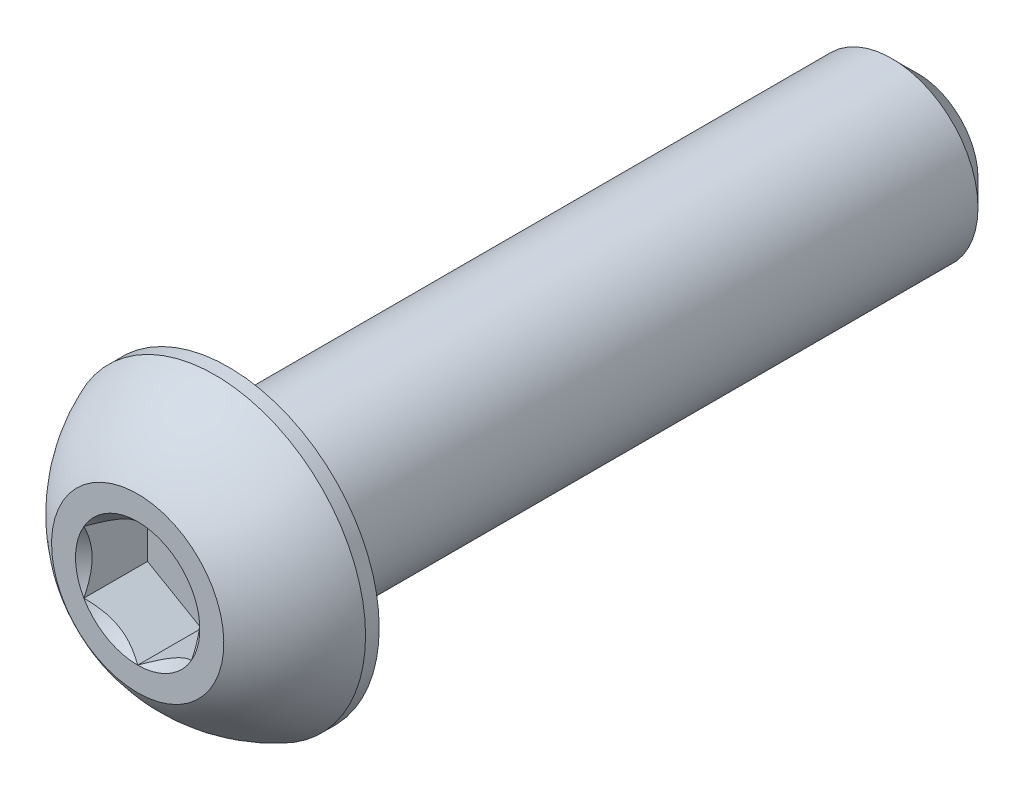
ISO-10303-21;
HEADER;
FILE_DESCRIPTION(('STEP AP214'),'2;1');
FILE_NAME('part.step','',(''),(''),'','','');
FILE_SCHEMA(('AUTOMOTIVE_DESIGN { 1 0 10303 214 1 1 1 1 }'));
ENDSEC;
DATA;
#1=APPLICATION_CONTEXT('core data for automotive mechanical design processes');
#2=APPLICATION_PROTOCOL_DEFINITION('international standard','automotive_design',2000,#1);
#3=PRODUCT_CONTEXT('',#1,'mechanical');
#4=PRODUCT('Part','Part','',(#3));
#5=PRODUCT_RELATED_PRODUCT_CATEGORY('part','',(#4));
#6=PRODUCT_DEFINITION_FORMATION('','',#4);
#7=PRODUCT_DEFINITION_CONTEXT('part definition',#1,'design');
#8=PRODUCT_DEFINITION('design','',#6,#7);
#9=PRODUCT_DEFINITION_SHAPE('','',#8);
#10=(LENGTH_UNIT() NAMED_UNIT(*) SI_UNIT(.MILLI.,.METRE.));
#11=(NAMED_UNIT(*) PLANE_ANGLE_UNIT() SI_UNIT($,.RADIAN.));
#12=(NAMED_UNIT(*) SI_UNIT($,.STERADIAN.) SOLID_ANGLE_UNIT());
#13=UNCERTAINTY_MEASURE_WITH_UNIT(LENGTH_MEASURE(1.E-05),#10,'distance_accuracy_value','');
#14=(GEOMETRIC_REPRESENTATION_CONTEXT(3) GLOBAL_UNCERTAINTY_ASSIGNED_CONTEXT((#13)) GLOBAL_UNIT_ASSIGNED_CONTEXT((#10,
#11,#12)) REPRESENTATION_CONTEXT('',''));
#15=CARTESIAN_POINT('',(0.,0.,0.));
#16=DIRECTION('',(0.,0.,1.));
#17=DIRECTION('',(1.,0.,0.));
#18=AXIS2_PLACEMENT_3D('',#15,#16,#17);
#19=CARTESIAN_POINT('',(0.,-3.175,-28.7528));
#20=DIRECTION('',(0.,0.,-1.));
#21=DIRECTION('',(0.,1.,0.));
#22=AXIS2_PLACEMENT_3D('',#19,#20,#21);
#23=PLANE('',#22);
#24=CARTESIAN_POINT('',(0.,0.,-28.7528));
#25=DIRECTION('',(0.,0.,-1.));
#26=DIRECTION('',(0.,1.,0.));
#27=AXIS2_PLACEMENT_3D('',#24,#25,#26);
#28=CIRCLE('',#27,2.22250000000001);
#29=CARTESIAN_POINT('',(0.,-2.2225,-28.7528));
#30=VERTEX_POINT('',#29);
#31=EDGE_CURVE('E173',#30,#30,#28,.T.);
#32=ORIENTED_EDGE('',*,*,#31,.T.);
#33=EDGE_LOOP('',(#32));
#34=FACE_BOUND('',#33,.T.);
#35=ADVANCED_FACE('F34',(#34),#23,.T.);
#36=CARTESIAN_POINT('',(0.,0.,-28.7528));
#37=DIRECTION('',(0.,0.,-1.));
#38=DIRECTION('',(0.,1.,0.));
#39=AXIS2_PLACEMENT_3D('',#36,#37,#38);
#40=CYLINDRICAL_SURFACE('',#39,3.175);
#41=CARTESIAN_POINT('',(0.,0.,-27.8003));
#42=DIRECTION('',(0.,0.,-1.));
#43=DIRECTION('',(0.,1.,0.));
#44=AXIS2_PLACEMENT_3D('',#41,#42,#43);
#45=CIRCLE('',#44,3.175);
#46=CARTESIAN_POINT('',(0.,-3.175,-27.8003));
#47=VERTEX_POINT('',#46);
#48=EDGE_CURVE('E47',#47,#47,#45,.F.);
#49=ORIENTED_EDGE('',*,*,#48,.T.);
#50=EDGE_LOOP('',(#49));
#51=FACE_BOUND('',#50,.T.);
#52=CARTESIAN_POINT('',(0.,0.,-3.3528));
#53=DIRECTION('',(0.,0.,1.));
#54=DIRECTION('',(1.,0.,0.));
#55=AXIS2_PLACEMENT_3D('',#52,#53,#54);
#56=CIRCLE('',#55,3.175);
#57=CARTESIAN_POINT('',(3.175,0.,-3.3528));
#58=VERTEX_POINT('',#57);
#59=EDGE_CURVE('E170',#58,#58,#56,.F.);
#60=ORIENTED_EDGE('',*,*,#59,.T.);
#61=EDGE_LOOP('',(#60));
#62=FACE_BOUND('',#61,.T.);
#63=ADVANCED_FACE('F178',(#51,#62),#40,.T.);
#64=CARTESIAN_POINT('',(0.,0.,-28.7528));
#65=DIRECTION('',(0.,0.,1.));
#66=DIRECTION('',(0.,-1.,0.));
#67=AXIS2_PLACEMENT_3D('',#64,#65,#66);
#68=CONICAL_SURFACE('',#67,2.22250000000001,0.785398163397446);
#69=CARTESIAN_POINT('',(0.,-3.175,-27.8003));
#70=CARTESIAN_POINT('',(0.,-3.165078125,-27.810221875));
#71=CARTESIAN_POINT('',(0.,-3.15515625,-27.82014375));
#72=CARTESIAN_POINT('',(0.,-3.1353125,-27.8399875));
#73=CARTESIAN_POINT('',(0.,-3.125390625,-27.849909375));
#74=CARTESIAN_POINT('',(0.,-3.105546875,-27.869753125));
#75=CARTESIAN_POINT('',(0.,-3.095625,-27.879675));
#76=CARTESIAN_POINT('',(0.,-3.07578125,-27.89951875));
#77=CARTESIAN_POINT('',(0.,-3.065859375,-27.909440625));
#78=CARTESIAN_POINT('',(0.,-3.046015625,-27.929284375));
#79=CARTESIAN_POINT('',(0.,-3.03609375,-27.93920625));
#80=CARTESIAN_POINT('',(0.,-3.01625,-27.95905));
#81=CARTESIAN_POINT('',(0.,-3.006328125,-27.968971875));
#82=CARTESIAN_POINT('',(0.,-2.986484375,-27.988815625));
#83=CARTESIAN_POINT('',(0.,-2.9765625,-27.9987375));
#84=CARTESIAN_POINT('',(0.,-2.95671875,-28.01858125));
#85=CARTESIAN_POINT('',(0.,-2.946796875,-28.028503125));
#86=CARTESIAN_POINT('',(0.,-2.926953125,-28.048346875));
#87=CARTESIAN_POINT('',(0.,-2.91703125,-28.05826875));
#88=CARTESIAN_POINT('',(0.,-2.8971875,-28.0781125));
#89=CARTESIAN_POINT('',(0.,-2.887265625,-28.088034375));
#90=CARTESIAN_POINT('',(0.,-2.867421875,-28.107878125));
#91=CARTESIAN_POINT('',(0.,-2.8575,-28.1178));
#92=CARTESIAN_POINT('',(0.,-2.83765625,-28.13764375));
#93=CARTESIAN_POINT('',(0.,-2.827734375,-28.147565625));
#94=CARTESIAN_POINT('',(0.,-2.807890625,-28.167409375));
#95=CARTESIAN_POINT('',(0.,-2.79796875,-28.17733125));
#96=CARTESIAN_POINT('',(0.,-2.778125,-28.197175));
#97=CARTESIAN_POINT('',(0.,-2.768203125,-28.207096875));
#98=CARTESIAN_POINT('',(0.,-2.748359375,-28.226940625));
#99=CARTESIAN_POINT('',(0.,-2.7384375,-28.2368625));
#100=CARTESIAN_POINT('',(0.,-2.71859375,-28.25670625));
#101=CARTESIAN_POINT('',(0.,-2.708671875,-28.266628125));
#102=CARTESIAN_POINT('',(0.,-2.688828125,-28.286471875));
#103=CARTESIAN_POINT('',(0.,-2.67890625,-28.29639375));
#104=CARTESIAN_POINT('',(0.,-2.6590625,-28.3162375));
#105=CARTESIAN_POINT('',(0.,-2.649140625,-28.326159375));
#106=CARTESIAN_POINT('',(0.,-2.629296875,-28.346003125));
#107=CARTESIAN_POINT('',(0.,-2.619375,-28.355925));
#108=CARTESIAN_POINT('',(0.,-2.59953125,-28.37576875));
#109=CARTESIAN_POINT('',(0.,-2.589609375,-28.385690625));
#110=CARTESIAN_POINT('',(0.,-2.569765625,-28.405534375));
#111=CARTESIAN_POINT('',(0.,-2.55984375,-28.41545625));
#112=CARTESIAN_POINT('',(0.,-2.54,-28.4353));
#113=CARTESIAN_POINT('',(0.,-2.530078125,-28.445221875));
#114=CARTESIAN_POINT('',(0.,-2.510234375,-28.465065625));
#115=CARTESIAN_POINT('',(0.,-2.5003125,-28.4749875));
#116=CARTESIAN_POINT('',(0.,-2.48046875,-28.49483125));
#117=CARTESIAN_POINT('',(0.,-2.470546875,-28.504753125));
#118=CARTESIAN_POINT('',(0.,-2.450703125,-28.524596875));
#119=CARTESIAN_POINT('',(0.,-2.44078125,-28.53451875));
#120=CARTESIAN_POINT('',(0.,-2.4209375,-28.5543625));
#121=CARTESIAN_POINT('',(0.,-2.411015625,-28.564284375));
#122=CARTESIAN_POINT('',(0.,-2.391171875,-28.584128125));
#123=CARTESIAN_POINT('',(0.,-2.38125,-28.59405));
#124=CARTESIAN_POINT('',(0.,-2.36140625,-28.61389375));
#125=CARTESIAN_POINT('',(0.,-2.351484375,-28.623815625));
#126=CARTESIAN_POINT('',(0.,-2.331640625,-28.643659375));
#127=CARTESIAN_POINT('',(0.,-2.32171875,-28.65358125));
#128=CARTESIAN_POINT('',(0.,-2.301875,-28.673425));
#129=CARTESIAN_POINT('',(0.,-2.291953125,-28.683346875));
#130=CARTESIAN_POINT('',(0.,-2.272109375,-28.703190625));
#131=CARTESIAN_POINT('',(0.,-2.2621875,-28.7131125));
#132=CARTESIAN_POINT('',(0.,-2.24234375,-28.73295625));
#133=CARTESIAN_POINT('',(0.,-2.232421875,-28.742878125));
#134=CARTESIAN_POINT('',(0.,-2.2225,-28.7528));
#135=B_SPLINE_CURVE_WITH_KNOTS('',3,(#69,#70,#71,#72,#73,#74,#75,#76,#77,#78,#79,#80,#81,#82,
#83,#84,#85,#86,#87,#88,#89,#90,#91,#92,#93,#94,#95,#96,#97,#98,#99,#100,#101,#102,#103,#104,
#105,#106,#107,#108,#109,#110,#111,#112,#113,#114,#115,#116,#117,#118,#119,#120,#121,#122,#123,
#124,#125,#126,#127,#128,#129,#130,#131,#132,#133,#134),.UNSPECIFIED.,.F.,.F.,(4,2,2,2,2,2,2,2,
2,2,2,2,2,2,2,2,2,2,2,2,2,2,2,2,2,2,2,2,2,2,2,2,4),(0.,0.042094950567512,0.0841899011350241,
0.126284851702536,0.168379802270048,0.21047475283756,0.25256970340507,0.294664653972582,
0.336759604540094,0.378854555107606,0.420949505675118,0.463044456242628,0.50513940681014,
0.547234357377652,0.589329307945164,0.631424258512676,0.673519209080186,0.715614159647698,
0.75770911021521,0.799804060782723,0.841899011350235,0.883993961917747,0.926088912485257,
0.968183863052769,1.01027881362028,1.05237376418779,1.09446871475531,1.13656366532281,
1.17865861589033,1.22075356645784,1.26284851702535,1.30494346759286,1.34703841816037),.UNSPECIFIED.);
#136=EDGE_CURVE('BSEAM36',#47,#30,#135,.T.);
#137=ORIENTED_EDGE('',*,*,#48,.F.);
#138=ORIENTED_EDGE('',*,*,#31,.F.);
#139=ORIENTED_EDGE('',*,*,#136,.T.);
#140=ORIENTED_EDGE('',*,*,#136,.F.);
#141=EDGE_LOOP('',(#137,#139,#138,#140));
#142=FACE_BOUND('',#141,.T.);
#143=ADVANCED_FACE('F36',(#142),#68,.T.);
#144=CARTESIAN_POINT('',(0.,0.,-5.060315));
#145=DIRECTION('',(0.,0.,1.));
#146=DIRECTION('',(0.,-1.,0.));
#147=AXIS2_PLACEMENT_3D('',#144,#145,#146);
#148=SPHERICAL_SURFACE('',#147,5.97389428256184);
#149=CARTESIAN_POINT('',(0.,0.,0.));
#150=DIRECTION('',(0.,0.,1.));
#151=DIRECTION('',(1.,0.,0.));
#152=AXIS2_PLACEMENT_3D('',#149,#150,#151);
#153=CIRCLE('',#152,3.175);
#154=CARTESIAN_POINT('',(0.,-3.175,0.));
#155=VERTEX_POINT('',#154);
#156=EDGE_CURVE('E167',#155,#155,#153,.T.);
#157=CARTESIAN_POINT('',(0.,0.,-2.84988));
#158=DIRECTION('',(0.,0.,1.));
#159=DIRECTION('',(1.,0.,0.));
#160=AXIS2_PLACEMENT_3D('',#157,#158,#159);
#161=CIRCLE('',#160,5.5499);
#162=CARTESIAN_POINT('',(0.,-5.5499,-2.84988));
#163=VERTEX_POINT('',#162);
#164=EDGE_CURVE('E161',#163,#163,#161,.T.);
#165=CARTESIAN_POINT('',(0.,-3.175,0.));
#166=CARTESIAN_POINT('',(0.,-3.20828343957184,-0.0208830076580502));
#167=CARTESIAN_POINT('',(0.,-3.24136078860705,-0.0420944789280503));
#168=CARTESIAN_POINT('',(0.,-3.30709055775141,-0.0851658910984718));
#169=CARTESIAN_POINT('',(0.,-3.33974297786056,-0.107025831998893));
#170=CARTESIAN_POINT('',(0.,-3.40461014130008,-0.151385725836676));
#171=CARTESIAN_POINT('',(0.,-3.43682488463043,-0.173885678774039));
#172=CARTESIAN_POINT('',(0.,-3.50080416139461,-0.219516822259479));
#173=CARTESIAN_POINT('',(0.,-3.53256869482844,-0.242648012807557));
#174=CARTESIAN_POINT('',(0.,-3.59563518208834,-0.289532629449102));
#175=CARTESIAN_POINT('',(0.,-3.62693713591442,-0.313286055542569));
#176=CARTESIAN_POINT('',(0.,-3.68906627753106,-0.36140589409133));
#177=CARTESIAN_POINT('',(0.,-3.71989346532163,-0.385772306546626));
#178=CARTESIAN_POINT('',(0.,-3.78106107243204,-0.435108631276877));
#179=CARTESIAN_POINT('',(0.,-3.8114014917519,-0.460078543551833));
#180=CARTESIAN_POINT('',(0.,-3.87158374923259,-0.510612146063938));
#181=CARTESIAN_POINT('',(0.,-3.90142558739343,-0.536175836301086));
#182=CARTESIAN_POINT('',(0.,-3.96059906392414,-0.587887041792083));
#183=CARTESIAN_POINT('',(0.,-3.989930702294,-0.614034557045931));
#184=CARTESIAN_POINT('',(0.,-4.04807235926832,-0.666903232293407));
#185=CARTESIAN_POINT('',(0.,-4.07688237787279,-0.693624392287034));
#186=CARTESIAN_POINT('',(0.,-4.13396957842491,-0.747629953401057));
#187=CARTESIAN_POINT('',(0.,-4.16224676037257,-0.774914354521453));
#188=CARTESIAN_POINT('',(0.,-4.21825727817542,-0.830035774981947));
#189=CARTESIAN_POINT('',(0.,-4.24599061403061,-0.857872794322045));
#190=CARTESIAN_POINT('',(0.,-4.30090264195357,-0.91408861315902));
#191=CARTESIAN_POINT('',(0.,-4.32808133402134,-0.942467412655899));
#192=CARTESIAN_POINT('',(0.,-4.38187349261953,-0.999755742806741));
#193=CARTESIAN_POINT('',(0.,-4.40848695914995,-1.0286652734607));
#194=CARTESIAN_POINT('',(0.,-4.46113830498838,-1.08700381029123));
#195=CARTESIAN_POINT('',(0.,-4.48717618429639,-1.11643281646778));
#196=CARTESIAN_POINT('',(0.,-4.53866621810402,-1.17579884645643));
#197=CARTESIAN_POINT('',(0.,-4.56411837260364,-1.20573587026853));
#198=CARTESIAN_POINT('',(0.,-4.61442704725457,-1.26610627984964));
#199=CARTESIAN_POINT('',(0.,-4.63928356740587,-1.29653966561866));
#200=CARTESIAN_POINT('',(0.,-4.68839129572448,-1.3578909501815));
#201=CARTESIAN_POINT('',(0.,-4.71264250389178,-1.38880884897531));
#202=CARTESIAN_POINT('',(0.,-4.76053016627881,-1.45111712201534));
#203=CARTESIAN_POINT('',(0.,-4.78416662049853,-1.48250749626155));
#204=CARTESIAN_POINT('',(0.,-4.8308155723751,-1.54574849868041));
#205=CARTESIAN_POINT('',(0.,-4.85382807003194,-1.57759912685306));
#206=CARTESIAN_POINT('',(0.,-4.89922014909859,-1.64174823640362));
#207=CARTESIAN_POINT('',(0.,-4.92159973050841,-1.67404671778154));
#208=CARTESIAN_POINT('',(0.,-4.96571726381658,-1.73907895865427));
#209=CARTESIAN_POINT('',(0.,-4.98745521571493,-1.77181271814908));
#210=CARTESIAN_POINT('',(0.,-5.03028102654719,-1.83770277069632));
#211=CARTESIAN_POINT('',(0.,-5.0513688854811,-1.87085906374874));
#212=CARTESIAN_POINT('',(0.,-5.09288630004063,-1.93758127434189));
#213=CARTESIAN_POINT('',(0.,-5.11331585566624,-1.97114719188261));
#214=CARTESIAN_POINT('',(0.,-5.15350870956168,-2.03867558290299));
#215=CARTESIAN_POINT('',(0.,-5.17327200783151,-2.07263805638265));
#216=CARTESIAN_POINT('',(0.,-5.21212465239608,-2.14094633632486));
#217=CARTESIAN_POINT('',(0.,-5.23121399869082,-2.17529214278741));
#218=CARTESIAN_POINT('',(0.,-5.26871130697935,-2.2443537165359));
#219=CARTESIAN_POINT('',(0.,-5.28711926897315,-2.27906948382184));
#220=CARTESIAN_POINT('',(0.,-5.32324664200827,-2.3488574628552));
#221=CARTESIAN_POINT('',(0.,-5.3409660530496,-2.38392967460262));
#222=CARTESIAN_POINT('',(0.,-5.37570942417474,-2.45441688802313));
#223=CARTESIAN_POINT('',(0.,-5.39273338425856,-2.48983188969622));
#224=CARTESIAN_POINT('',(0.,-5.42607922958184,-2.56099089271574));
#225=CARTESIAN_POINT('',(0.,-5.44240111482132,-2.59673489406217));
#226=CARTESIAN_POINT('',(0.,-5.47433643994316,-2.66853798649801));
#227=CARTESIAN_POINT('',(0.,-5.48994987982553,-2.70459707758742));
#228=CARTESIAN_POINT('',(0.,-5.52046229408188,-2.77701628549785));
#229=CARTESIAN_POINT('',(0.,-5.53536126845586,-2.81337640231887));
#230=CARTESIAN_POINT('',(0.,-5.5499,-2.84988));
#231=B_SPLINE_CURVE_WITH_KNOTS('',3,(#165,#166,#167,#168,#169,#170,#171,#172,#173,#174,#175,
#176,#177,#178,#179,#180,#181,#182,#183,#184,#185,#186,#187,#188,#189,#190,#191,#192,#193,#194,
#195,#196,#197,#198,#199,#200,#201,#202,#203,#204,#205,#206,#207,#208,#209,#210,#211,#212,#213,
#214,#215,#216,#217,#218,#219,#220,#221,#222,#223,#224,#225,#226,#227,#228,#229,#230),
.UNSPECIFIED.,.F.,.F.,(4,2,2,2,2,2,2,2,2,2,2,2,2,2,2,2,2,2,2,2,2,2,2,2,2,2,2,2,2,2,2,2,4),(0.,
0.1178750807537,0.235750161507399,0.353625242261099,0.471500323014798,0.589375403768498,
0.707250484522198,0.825125565275897,0.943000646029597,1.0608757267833,1.17875080753699,
1.2966258882907,1.41450096904439,1.53237604979809,1.65025113055179,1.76812621130549,
1.88600129205919,2.00387637281289,2.12175145356659,2.23962653432029,2.35750161507399,
2.47537669582769,2.59325177658139,2.71112685733509,2.82900193808879,2.94687701884249,
3.06475209959619,3.18262718034989,3.30050226110359,3.41837734185729,3.53625242261099,
3.65412750336469,3.77200258411839),.UNSPECIFIED.);
#232=EDGE_CURVE('BSEAM183',#155,#163,#231,.T.);
#233=ORIENTED_EDGE('',*,*,#156,.F.);
#234=ORIENTED_EDGE('',*,*,#164,.T.);
#235=ORIENTED_EDGE('',*,*,#232,.T.);
#236=ORIENTED_EDGE('',*,*,#232,.F.);
#237=EDGE_LOOP('',(#233,#235,#234,#236));
#238=FACE_BOUND('',#237,.T.);
#239=ADVANCED_FACE('F183',(#238),#148,.T.);
#240=CARTESIAN_POINT('',(0.,-3.175,0.));
#241=DIRECTION('',(0.,0.,-1.));
#242=DIRECTION('',(-1.,0.,0.));
#243=AXIS2_PLACEMENT_3D('',#240,#241,#242);
#244=PLANE('',#243);
#245=CARTESIAN_POINT('',(0.,0.,0.));
#246=DIRECTION('',(0.,0.,1.));
#247=DIRECTION('',(1.,0.,0.));
#248=AXIS2_PLACEMENT_3D('',#245,#246,#247);
#249=CIRCLE('',#248,2.29135888084633);
#250=CARTESIAN_POINT('',(-1.984375,1.14567944042316,0.));
#251=VERTEX_POINT('',#250);
#252=CARTESIAN_POINT('',(-1.984375,-1.14567944042316,0.));
#253=VERTEX_POINT('',#252);
#254=EDGE_CURVE('E60',#251,#253,#249,.T.);
#255=ORIENTED_EDGE('',*,*,#254,.F.);
#256=CARTESIAN_POINT('',(0.,2.29135888084633,0.));
#257=VERTEX_POINT('',#256);
#258=EDGE_CURVE('E132',#257,#251,#249,.T.);
#259=ORIENTED_EDGE('',*,*,#258,.F.);
#260=CARTESIAN_POINT('',(1.984375,1.14567944042316,0.));
#261=VERTEX_POINT('',#260);
#262=EDGE_CURVE('E129',#261,#257,#249,.T.);
#263=ORIENTED_EDGE('',*,*,#262,.F.);
#264=CARTESIAN_POINT('',(1.984375,-1.14567944042316,0.));
#265=VERTEX_POINT('',#264);
#266=EDGE_CURVE('E100',#265,#261,#249,.T.);
#267=ORIENTED_EDGE('',*,*,#266,.F.);
#268=CARTESIAN_POINT('',(0.,-2.29135888084633,0.));
#269=VERTEX_POINT('',#268);
#270=EDGE_CURVE('E92',#269,#265,#249,.T.);
#271=ORIENTED_EDGE('',*,*,#270,.F.);
#272=EDGE_CURVE('E53',#253,#269,#249,.T.);
#273=ORIENTED_EDGE('',*,*,#272,.F.);
#274=EDGE_LOOP('',(#255,#259,#263,#267,#271,#273));
#275=FACE_BOUND('',#274,.T.);
#276=ORIENTED_EDGE('',*,*,#156,.T.);
#277=EDGE_LOOP('',(#276));
#278=FACE_BOUND('',#277,.T.);
#279=ADVANCED_FACE('F126',(#275,#278),#244,.F.);
#280=CARTESIAN_POINT('',(0.,-5.5499,-3.3528));
#281=DIRECTION('',(0.,0.,1.));
#282=DIRECTION('',(1.,0.,0.));
#283=AXIS2_PLACEMENT_3D('',#280,#281,#282);
#284=PLANE('',#283);
#285=ORIENTED_EDGE('',*,*,#59,.F.);
#286=EDGE_LOOP('',(#285));
#287=FACE_BOUND('',#286,.T.);
#288=CARTESIAN_POINT('',(0.,0.,-3.3528));
#289=DIRECTION('',(0.,0.,1.));
#290=DIRECTION('',(1.,0.,0.));
#291=AXIS2_PLACEMENT_3D('',#288,#289,#290);
#292=CIRCLE('',#291,5.5499);
#293=CARTESIAN_POINT('',(5.5499,0.,-3.3528));
#294=VERTEX_POINT('',#293);
#295=EDGE_CURVE('E164',#294,#294,#292,.T.);
#296=ORIENTED_EDGE('',*,*,#295,.F.);
#297=EDGE_LOOP('',(#296));
#298=FACE_BOUND('',#297,.T.);
#299=ADVANCED_FACE('F197',(#287,#298),#284,.F.);
#300=CARTESIAN_POINT('',(0.,0.,0.));
#301=DIRECTION('',(0.,0.,1.));
#302=DIRECTION('',(1.,0.,0.));
#303=AXIS2_PLACEMENT_3D('',#300,#301,#302);
#304=CYLINDRICAL_SURFACE('',#303,5.5499);
#305=ORIENTED_EDGE('',*,*,#164,.F.);
#306=EDGE_LOOP('',(#305));
#307=FACE_BOUND('',#306,.T.);
#308=ORIENTED_EDGE('',*,*,#295,.T.);
#309=EDGE_LOOP('',(#308));
#310=FACE_BOUND('',#309,.T.);
#311=ADVANCED_FACE('F200',(#307,#310),#304,.T.);
#312=CARTESIAN_POINT('',(0.,0.,0.));
#313=DIRECTION('',(0.,0.,1.));
#314=DIRECTION('',(1.,0.,0.));
#315=AXIS2_PLACEMENT_3D('',#312,#313,#314);
#316=CONICAL_SURFACE('',#315,2.29135888084633,0.78539816339745);
#317=ORIENTED_EDGE('',*,*,#266,.T.);
#318=CARTESIAN_POINT('',(1.984375,-2.28495242157822,0.734984078816568));
#319=CARTESIAN_POINT('',(1.984375,-2.22931635455402,0.692986685550762));
#320=CARTESIAN_POINT('',(1.984375,-2.17336876548389,0.651396054076336));
#321=CARTESIAN_POINT('',(1.984375,-2.06072770258171,0.569208461471479));
#322=CARTESIAN_POINT('',(1.984375,-2.00403404503435,0.528611752405042));
#323=CARTESIAN_POINT('',(1.984375,-1.88936329173488,0.448303503174668));
#324=CARTESIAN_POINT('',(1.984375,-1.83137965519348,0.408601258813307));
#325=CARTESIAN_POINT('',(1.984375,-1.7144280213784,0.330685173401292));
#326=CARTESIAN_POINT('',(1.984375,-1.65546009407228,0.292471227194368));
#327=CARTESIAN_POINT('',(1.984375,-1.47005472306035,0.176252834013637));
#328=CARTESIAN_POINT('',(1.984375,-1.34163909427883,0.101347886872381));
#329=CARTESIAN_POINT('',(1.984375,-1.0784038470548,-0.0356697845602627));
#330=CARTESIAN_POINT('',(1.984375,-0.943607781407424,-0.0978256335176254));
#331=CARTESIAN_POINT('',(1.984375,-0.741275100444881,-0.173867421311381));
#332=CARTESIAN_POINT('',(1.984375,-0.676735408881095,-0.195691938673995));
#333=CARTESIAN_POINT('',(1.984375,-0.546098118112761,-0.234159536462205));
#334=CARTESIAN_POINT('',(1.984375,-0.480000411919955,-0.250802259934452));
#335=CARTESIAN_POINT('',(1.984375,-0.347746170028531,-0.277764619130277));
#336=CARTESIAN_POINT('',(1.984375,-0.281612071479122,-0.288192590264109));
#337=CARTESIAN_POINT('',(1.984375,-0.14863662005235,-0.302521852623404));
#338=CARTESIAN_POINT('',(1.984375,-0.0817953907393235,-0.306424265772614));
#339=CARTESIAN_POINT('',(1.984375,0.0495156750890644,-0.307412948667327));
#340=CARTESIAN_POINT('',(1.984375,0.113983775102991,-0.304740821124985));
#341=CARTESIAN_POINT('',(1.984375,0.242367515846177,-0.293260789502485));
#342=CARTESIAN_POINT('',(1.984375,0.30628310229592,-0.284452289360786));
#343=CARTESIAN_POINT('',(1.984375,0.434181040262184,-0.261030978667103));
#344=CARTESIAN_POINT('',(1.984375,0.498145026858309,-0.246319393767914));
#345=CARTESIAN_POINT('',(1.984375,0.624675616953007,-0.211873818587874));
#346=CARTESIAN_POINT('',(1.984375,0.687242336899689,-0.192140248550805));
#347=CARTESIAN_POINT('',(1.984375,0.884225483826088,-0.12258776276924));
#348=CARTESIAN_POINT('',(1.984375,1.01583674256468,-0.0648475887435034));
#349=CARTESIAN_POINT('',(1.984375,1.27288659242652,0.063530336588798));
#350=CARTESIAN_POINT('',(1.984375,1.3983008827048,0.134214424919413));
#351=CARTESIAN_POINT('',(1.984375,1.57956687990221,0.244516663813199));
#352=CARTESIAN_POINT('',(1.984375,1.63738271299424,0.280969829475364));
#353=CARTESIAN_POINT('',(1.984375,1.75202215386202,0.355415963291705));
#354=CARTESIAN_POINT('',(1.984375,1.80884568601362,0.393409048078054));
#355=CARTESIAN_POINT('',(1.984375,1.92116923084255,0.470338808893091));
#356=CARTESIAN_POINT('',(1.984375,1.97667624512253,0.509265313038791));
#357=CARTESIAN_POINT('',(1.984375,2.08693170717166,0.588147746121386));
#358=CARTESIAN_POINT('',(1.984375,2.14168035934793,0.62810338902403));
#359=CARTESIAN_POINT('',(1.984375,2.19611149046622,0.668480611285427));
#360=B_SPLINE_CURVE_WITH_KNOTS('',3,(#318,#319,#320,#321,#322,#323,#324,#325,#326,#327,#328,
#329,#330,#331,#332,#333,#334,#335,#336,#337,#338,#339,#340,#341,#342,#343,#344,#345,#346,#347,
#348,#349,#350,#351,#352,#353,#354,#355,#356,#357,#358,#359),.UNSPECIFIED.,.F.,.F.,(4,2,2,2,2,2,
2,2,2,2,2,2,2,2,2,2,2,2,2,2,4),(0.,0.209126070008322,0.418304637356569,0.629103979977992,
0.839888401371185,1.28549951116127,1.72957750768351,1.93379389749971,2.13802435186698,
2.33858179514334,2.53910475350639,2.73236963400794,2.92565329006887,3.12231577097487,
3.31896180041345,3.74886295245172,4.18033428125362,4.3853601718029,4.59040161996383,
4.79377749165108,4.99709743524131),.UNSPECIFIED.);
#361=EDGE_CURVE('E11',#265,#261,#360,.T.);
#362=ORIENTED_EDGE('',*,*,#361,.F.);
#363=EDGE_LOOP('',(#317,#362));
#364=FACE_BOUND('',#363,.T.);
#365=ADVANCED_FACE('F104',(#364),#316,.F.);
#366=ORIENTED_EDGE('',*,*,#262,.T.);
#367=CARTESIAN_POINT('',(1.984575,1.14556397036933,0.000115478781843379));
#368=CARTESIAN_POINT('',(1.9163590048332,1.18494849354192,-0.0392371477360855));
#369=CARTESIAN_POINT('',(1.84700231489303,1.22499159714897,-0.0762786895538155));
#370=CARTESIAN_POINT('',(1.70557619954781,1.30664400291398,-0.144101141576677));
#371=CARTESIAN_POINT('',(1.63349332126322,1.34826107209555,-0.174844310908246));
#372=CARTESIAN_POINT('',(1.488141602734,1.43217992591557,-0.227508111188786));
#373=CARTESIAN_POINT('',(1.41490978751306,1.47446033414663,-0.249561124120036));
#374=CARTESIAN_POINT('',(1.26683381740529,1.55995203534886,-0.283538507056124));
#375=CARTESIAN_POINT('',(1.19199418724658,1.60316071596705,-0.295488243908271));
#376=CARTESIAN_POINT('',(1.06301458545618,1.6776271237807,-0.306269900918094));
#377=CARTESIAN_POINT('',(1.00904128422756,1.7087886237741,-0.30786610094093));
#378=CARTESIAN_POINT('',(0.901182881480199,1.77106070163465,-0.305178161134708));
#379=CARTESIAN_POINT('',(0.847297817514476,1.80217125782056,-0.300891959659541));
#380=CARTESIAN_POINT('',(0.740036461751395,1.86409863044402,-0.286683126986481));
#381=CARTESIAN_POINT('',(0.686660807239859,1.89491507894443,-0.276754189547727));
#382=CARTESIAN_POINT('',(0.580832482591103,1.95601509066828,-0.251804915725461));
#383=CARTESIAN_POINT('',(0.528379742028898,1.9862986945516,-0.236784969610512));
#384=CARTESIAN_POINT('',(0.394017661036351,2.06387267818152,-0.19219214836433));
#385=CARTESIAN_POINT('',(0.312941642841675,2.11068193911104,-0.159257004061667));
#386=CARTESIAN_POINT('',(0.19372669327016,2.17951072233758,-0.103657558797803));
#387=CARTESIAN_POINT('',(0.154440075613998,2.20219286161692,-0.0841224079481375));
#388=CARTESIAN_POINT('',(0.0765946381319467,2.24713694590237,-0.0432712618805984));
#389=CARTESIAN_POINT('',(0.0380353888983008,2.26939913882716,-0.0219563604316496));
#390=CARTESIAN_POINT('',(-0.00020000000000058,2.29147435090017,0.000115478781842942));
#391=B_SPLINE_CURVE_WITH_KNOTS('',3,(#367,#368,#369,#370,#371,#372,#373,#374,#375,#376,#377,
#378,#379,#380,#381,#382,#383,#384,#385,#386,#387,#388,#389,#390),.UNSPECIFIED.,.F.,.F.,(4,2,2,
2,2,2,2,2,2,2,2,4),(0.,0.264339630306627,0.530219665093694,0.79187641637146,1.05287424418109,
1.239639843932,1.42647091743852,1.61351120244035,1.8005371524754,2.09764209964316,
2.24579179873714,2.39385111134157),.UNSPECIFIED.);
#392=EDGE_CURVE('E131',#261,#257,#391,.T.);
#393=ORIENTED_EDGE('',*,*,#392,.F.);
#394=EDGE_LOOP('',(#366,#393));
#395=FACE_BOUND('',#394,.T.);
#396=ADVANCED_FACE('F280',(#395),#316,.F.);
#397=ORIENTED_EDGE('',*,*,#258,.T.);
#398=CARTESIAN_POINT('',(0.000199999999999608,2.29147435090017,0.000115478781843248));
#399=CARTESIAN_POINT('',(-0.0680159951668025,2.25208982772757,-0.0392371477360854));
#400=CARTESIAN_POINT('',(-0.137372685106966,2.21204672412052,-0.0762786895538155));
#401=CARTESIAN_POINT('',(-0.278798800452188,2.13039431835551,-0.144101141576677));
#402=CARTESIAN_POINT('',(-0.350881678736783,2.08877724917394,-0.174844310908246));
#403=CARTESIAN_POINT('',(-0.496233397266004,2.00485839535392,-0.227508111188786));
#404=CARTESIAN_POINT('',(-0.569465212486939,1.96257798712287,-0.249561124120036));
#405=CARTESIAN_POINT('',(-0.717541182594707,1.87708628592063,-0.283538507056124));
#406=CARTESIAN_POINT('',(-0.792380812753425,1.83387760530244,-0.295488243908272));
#407=CARTESIAN_POINT('',(-0.921360414543816,1.75941119748879,-0.306269900918094));
#408=CARTESIAN_POINT('',(-0.975333715772443,1.72824969749539,-0.307866100940931));
#409=CARTESIAN_POINT('',(-1.0831921185198,1.66597761963484,-0.305178161134708));
#410=CARTESIAN_POINT('',(-1.13707718248552,1.63486706344893,-0.300891959659541));
#411=CARTESIAN_POINT('',(-1.2443385382486,1.57293969082547,-0.286683126986481));
#412=CARTESIAN_POINT('',(-1.29771419276014,1.54212324232506,-0.276754189547727));
#413=CARTESIAN_POINT('',(-1.4035425174089,1.48102323060122,-0.251804915725462));
#414=CARTESIAN_POINT('',(-1.4559952579711,1.45073962671789,-0.236784969610512));
#415=CARTESIAN_POINT('',(-1.59035733896365,1.37316564308797,-0.19219214836433));
#416=CARTESIAN_POINT('',(-1.67143335715832,1.32635638215845,-0.159257004061668));
#417=CARTESIAN_POINT('',(-1.79064830672984,1.25752759893191,-0.103657558797804));
#418=CARTESIAN_POINT('',(-1.829934924386,1.23484545965257,-0.0841224079481378));
#419=CARTESIAN_POINT('',(-1.90778036186805,1.18990137536712,-0.0432712618805986));
#420=CARTESIAN_POINT('',(-1.9463396111017,1.16763918244233,-0.0219563604316498));
#421=CARTESIAN_POINT('',(-1.984575,1.14556397036933,0.000115478781842511));
#422=B_SPLINE_CURVE_WITH_KNOTS('',3,(#398,#399,#400,#401,#402,#403,#404,#405,#406,#407,#408,
#409,#410,#411,#412,#413,#414,#415,#416,#417,#418,#419,#420,#421),.UNSPECIFIED.,.F.,.F.,(4,2,2,
2,2,2,2,2,2,2,2,4),(0.,0.264339630306627,0.530219665093694,0.791876416371461,1.05287424418109,
1.239639843932,1.42647091743852,1.61351120244035,1.8005371524754,2.09764209964316,
2.24579179873714,2.39385111134157),.UNSPECIFIED.);
#423=EDGE_CURVE('E136',#257,#251,#422,.T.);
#424=ORIENTED_EDGE('',*,*,#423,.F.);
#425=EDGE_LOOP('',(#397,#424));
#426=FACE_BOUND('',#425,.T.);
#427=ADVANCED_FACE('F139',(#426),#316,.F.);
#428=ORIENTED_EDGE('',*,*,#254,.T.);
#429=CARTESIAN_POINT('',(-1.984375,-2.28495242157823,0.734984078816569));
#430=CARTESIAN_POINT('',(-1.984375,-2.22931635455402,0.692986685550762));
#431=CARTESIAN_POINT('',(-1.984375,-2.17336876548389,0.651396054076336));
#432=CARTESIAN_POINT('',(-1.984375,-2.06072770258171,0.56920846147148));
#433=CARTESIAN_POINT('',(-1.984375,-2.00403404503435,0.528611752405043));
#434=CARTESIAN_POINT('',(-1.984375,-1.88936329173489,0.448303503174669));
#435=CARTESIAN_POINT('',(-1.984375,-1.83137965519348,0.408601258813308));
#436=CARTESIAN_POINT('',(-1.984375,-1.7144280213784,0.330685173401292));
#437=CARTESIAN_POINT('',(-1.984375,-1.65546009407228,0.292471227194368));
#438=CARTESIAN_POINT('',(-1.984375,-1.47005472306035,0.176252834013636));
#439=CARTESIAN_POINT('',(-1.984375,-1.34163909427883,0.101347886872382));
#440=CARTESIAN_POINT('',(-1.984375,-1.0784038470548,-0.0356697845602624));
#441=CARTESIAN_POINT('',(-1.984375,-0.943607781407425,-0.0978256335176256));
#442=CARTESIAN_POINT('',(-1.984375,-0.741275100444882,-0.173867421311381));
#443=CARTESIAN_POINT('',(-1.984375,-0.676735408881095,-0.195691938673995));
#444=CARTESIAN_POINT('',(-1.984375,-0.546098118112762,-0.234159536462205));
#445=CARTESIAN_POINT('',(-1.984375,-0.480000411919956,-0.250802259934452));
#446=CARTESIAN_POINT('',(-1.984375,-0.347746170028532,-0.277764619130277));
#447=CARTESIAN_POINT('',(-1.984375,-0.281612071479123,-0.288192590264108));
#448=CARTESIAN_POINT('',(-1.984375,-0.14863662005235,-0.302521852623404));
#449=CARTESIAN_POINT('',(-1.984375,-0.0817953907393237,-0.306424265772614));
#450=CARTESIAN_POINT('',(-1.984375,0.0495156750890643,-0.307412948667328));
#451=CARTESIAN_POINT('',(-1.984375,0.113983775102991,-0.304740821124985));
#452=CARTESIAN_POINT('',(-1.984375,0.242367515846177,-0.293260789502485));
#453=CARTESIAN_POINT('',(-1.984375,0.306283102295919,-0.284452289360786));
#454=CARTESIAN_POINT('',(-1.984375,0.434181040262184,-0.261030978667103));
#455=CARTESIAN_POINT('',(-1.984375,0.498145026858309,-0.246319393767914));
#456=CARTESIAN_POINT('',(-1.984375,0.624675616953007,-0.211873818587874));
#457=CARTESIAN_POINT('',(-1.984375,0.687242336899689,-0.192140248550805));
#458=CARTESIAN_POINT('',(-1.984375,0.884225483826087,-0.12258776276924));
#459=CARTESIAN_POINT('',(-1.984375,1.01583674256468,-0.0648475887435036));
#460=CARTESIAN_POINT('',(-1.984375,1.27288659242652,0.0635303365887976));
#461=CARTESIAN_POINT('',(-1.984375,1.3983008827048,0.134214424919412));
#462=CARTESIAN_POINT('',(-1.984375,1.57956687990221,0.244516663813198));
#463=CARTESIAN_POINT('',(-1.984375,1.63738271299424,0.280969829475363));
#464=CARTESIAN_POINT('',(-1.984375,1.75202215386202,0.355415963291704));
#465=CARTESIAN_POINT('',(-1.984375,1.80884568601362,0.393409048078054));
#466=CARTESIAN_POINT('',(-1.984375,1.92116923084255,0.47033880889309));
#467=CARTESIAN_POINT('',(-1.984375,1.97667624512253,0.509265313038791));
#468=CARTESIAN_POINT('',(-1.984375,2.08693170717166,0.588147746121386));
#469=CARTESIAN_POINT('',(-1.984375,2.14168035934793,0.628103389024029));
#470=CARTESIAN_POINT('',(-1.984375,2.19611149046622,0.668480611285426));
#471=B_SPLINE_CURVE_WITH_KNOTS('',3,(#429,#430,#431,#432,#433,#434,#435,#436,#437,#438,#439,
#440,#441,#442,#443,#444,#445,#446,#447,#448,#449,#450,#451,#452,#453,#454,#455,#456,#457,#458,
#459,#460,#461,#462,#463,#464,#465,#466,#467,#468,#469,#470),.UNSPECIFIED.,.F.,.F.,(4,2,2,2,2,2,
2,2,2,2,2,2,2,2,2,2,2,2,2,2,4),(0.,0.209126070008322,0.41830463735657,0.629103979977993,
0.839888401371186,1.28549951116127,1.72957750768351,1.93379389749972,2.13802435186698,
2.33858179514334,2.53910475350639,2.73236963400794,2.92565329006887,3.12231577097488,
3.31896180041345,3.74886295245172,4.18033428125362,4.3853601718029,4.59040161996383,
4.79377749165108,4.99709743524131),.UNSPECIFIED.);
#472=EDGE_CURVE('E143',#251,#253,#471,.F.);
#473=ORIENTED_EDGE('',*,*,#472,.F.);
#474=EDGE_LOOP('',(#428,#473));
#475=FACE_BOUND('',#474,.T.);
#476=ADVANCED_FACE('F274',(#475),#316,.F.);
#477=ORIENTED_EDGE('',*,*,#272,.T.);
#478=CARTESIAN_POINT('',(-1.984575,-1.14556397036933,0.000115478781843379));
#479=CARTESIAN_POINT('',(-1.9163590048332,-1.18494849354192,-0.0392371477360847));
#480=CARTESIAN_POINT('',(-1.84700231489303,-1.22499159714897,-0.0762786895538149));
#481=CARTESIAN_POINT('',(-1.70557619954781,-1.30664400291398,-0.144101141576677));
#482=CARTESIAN_POINT('',(-1.63349332126322,-1.34826107209555,-0.174844310908247));
#483=CARTESIAN_POINT('',(-1.488141602734,-1.43217992591557,-0.227508111188786));
#484=CARTESIAN_POINT('',(-1.41490978751306,-1.47446033414663,-0.249561124120036));
#485=CARTESIAN_POINT('',(-1.26683381740529,-1.55995203534886,-0.283538507056124));
#486=CARTESIAN_POINT('',(-1.19199418724658,-1.60316071596705,-0.295488243908271));
#487=CARTESIAN_POINT('',(-1.06301458545618,-1.6776271237807,-0.306269900918094));
#488=CARTESIAN_POINT('',(-1.00904128422756,-1.7087886237741,-0.30786610094093));
#489=CARTESIAN_POINT('',(-0.9011828814802,-1.77106070163465,-0.305178161134707));
#490=CARTESIAN_POINT('',(-0.847297817514477,-1.80217125782056,-0.30089195965954));
#491=CARTESIAN_POINT('',(-0.740036461751396,-1.86409863044402,-0.286683126986481));
#492=CARTESIAN_POINT('',(-0.68666080723986,-1.89491507894443,-0.276754189547727));
#493=CARTESIAN_POINT('',(-0.580832482591103,-1.95601509066828,-0.251804915725461));
#494=CARTESIAN_POINT('',(-0.528379742028898,-1.9862986945516,-0.236784969610511));
#495=CARTESIAN_POINT('',(-0.394017661036351,-2.06387267818152,-0.19219214836433));
#496=CARTESIAN_POINT('',(-0.312941642841675,-2.11068193911104,-0.159257004061667));
#497=CARTESIAN_POINT('',(-0.19372669327016,-2.17951072233758,-0.103657558797803));
#498=CARTESIAN_POINT('',(-0.154440075613998,-2.20219286161692,-0.0841224079481371));
#499=CARTESIAN_POINT('',(-0.0765946381319465,-2.24713694590237,-0.0432712618805977));
#500=CARTESIAN_POINT('',(-0.0380353888983009,-2.26939913882716,-0.0219563604316487));
#501=CARTESIAN_POINT('',(0.000200000000000425,-2.29147435090017,0.000115478781843735));
#502=B_SPLINE_CURVE_WITH_KNOTS('',3,(#478,#479,#480,#481,#482,#483,#484,#485,#486,#487,#488,
#489,#490,#491,#492,#493,#494,#495,#496,#497,#498,#499,#500,#501),.UNSPECIFIED.,.F.,.F.,(4,2,2,
2,2,2,2,2,2,2,2,4),(0.,0.264339630306627,0.530219665093694,0.79187641637146,1.05287424418109,
1.239639843932,1.42647091743852,1.61351120244035,1.8005371524754,2.09764209964316,
2.24579179873714,2.39385111134157),.UNSPECIFIED.);
#503=EDGE_CURVE('E116',#253,#269,#502,.T.);
#504=ORIENTED_EDGE('',*,*,#503,.F.);
#505=EDGE_LOOP('',(#477,#504));
#506=FACE_BOUND('',#505,.T.);
#507=ADVANCED_FACE('F225',(#506),#316,.F.);
#508=ORIENTED_EDGE('',*,*,#270,.T.);
#509=CARTESIAN_POINT('',(-0.000199999999999594,-2.29147435090017,0.000115478781843681));
#510=CARTESIAN_POINT('',(0.0680159951668032,-2.25208982772757,-0.0392371477360843));
#511=CARTESIAN_POINT('',(0.137372685106967,-2.21204672412052,-0.0762786895538144));
#512=CARTESIAN_POINT('',(0.278798800452188,-2.13039431835551,-0.144101141576676));
#513=CARTESIAN_POINT('',(0.350881678736783,-2.08877724917394,-0.174844310908246));
#514=CARTESIAN_POINT('',(0.496233397266004,-2.00485839535392,-0.227508111188787));
#515=CARTESIAN_POINT('',(0.569465212486939,-1.96257798712287,-0.249561124120036));
#516=CARTESIAN_POINT('',(0.717541182594707,-1.87708628592063,-0.283538507056124));
#517=CARTESIAN_POINT('',(0.792380812753425,-1.83387760530244,-0.295488243908272));
#518=CARTESIAN_POINT('',(0.921360414543816,-1.75941119748879,-0.306269900918094));
#519=CARTESIAN_POINT('',(0.975333715772443,-1.72824969749539,-0.30786610094093));
#520=CARTESIAN_POINT('',(1.0831921185198,-1.66597761963484,-0.305178161134708));
#521=CARTESIAN_POINT('',(1.13707718248552,-1.63486706344893,-0.300891959659541));
#522=CARTESIAN_POINT('',(1.2443385382486,-1.57293969082547,-0.286683126986481));
#523=CARTESIAN_POINT('',(1.29771419276014,-1.54212324232506,-0.276754189547727));
#524=CARTESIAN_POINT('',(1.4035425174089,-1.48102323060122,-0.251804915725462));
#525=CARTESIAN_POINT('',(1.4559952579711,-1.45073962671789,-0.236784969610512));
#526=CARTESIAN_POINT('',(1.59035733896365,-1.37316564308797,-0.19219214836433));
#527=CARTESIAN_POINT('',(1.67143335715832,-1.32635638215845,-0.159257004061668));
#528=CARTESIAN_POINT('',(1.79064830672984,-1.25752759893191,-0.103657558797804));
#529=CARTESIAN_POINT('',(1.829934924386,-1.23484545965257,-0.0841224079481379));
#530=CARTESIAN_POINT('',(1.90778036186805,-1.18990137536712,-0.0432712618805987));
#531=CARTESIAN_POINT('',(1.9463396111017,-1.16763918244233,-0.0219563604316498));
#532=CARTESIAN_POINT('',(1.984575,-1.14556397036933,0.000115478781842673));
#533=B_SPLINE_CURVE_WITH_KNOTS('',3,(#509,#510,#511,#512,#513,#514,#515,#516,#517,#518,#519,
#520,#521,#522,#523,#524,#525,#526,#527,#528,#529,#530,#531,#532),.UNSPECIFIED.,.F.,.F.,(4,2,2,
2,2,2,2,2,2,2,2,4),(0.,0.264339630306627,0.530219665093695,0.791876416371461,1.05287424418109,
1.239639843932,1.42647091743852,1.61351120244035,1.8005371524754,2.09764209964316,
2.24579179873714,2.39385111134157),.UNSPECIFIED.);
#534=EDGE_CURVE('E96',#269,#265,#533,.T.);
#535=ORIENTED_EDGE('',*,*,#534,.F.);
#536=EDGE_LOOP('',(#508,#535));
#537=FACE_BOUND('',#536,.T.);
#538=ADVANCED_FACE('F94',(#537),#316,.F.);
#539=CARTESIAN_POINT('',(1.984375,-1.14567944042316,-2.34696));
#540=DIRECTION('',(0.,0.,1.));
#541=DIRECTION('',(1.,0.,0.));
#542=AXIS2_PLACEMENT_3D('',#539,#540,#541);
#543=PLANE('',#542);
#544=DIRECTION('',(0.866025403784438,0.5,0.));
#545=VECTOR('',#544,1.);
#546=CARTESIAN_POINT('',(0.,-2.29135888084633,-2.34696));
#547=LINE('',#546,#545);
#548=CARTESIAN_POINT('',(0.,-2.29135888084633,-2.34696));
#549=VERTEX_POINT('',#548);
#550=CARTESIAN_POINT('',(1.984375,-1.14567944042316,-2.34696));
#551=VERTEX_POINT('',#550);
#552=EDGE_CURVE('E115',#549,#551,#547,.T.);
#553=ORIENTED_EDGE('',*,*,#552,.T.);
#554=DIRECTION('',(0.,1.,0.));
#555=VECTOR('',#554,1.);
#556=CARTESIAN_POINT('',(1.984375,-1.14567944042316,-2.34696));
#557=LINE('',#556,#555);
#558=CARTESIAN_POINT('',(1.984375,1.14567944042316,-2.34696));
#559=VERTEX_POINT('',#558);
#560=EDGE_CURVE('E120',#551,#559,#557,.T.);
#561=ORIENTED_EDGE('',*,*,#560,.T.);
#562=DIRECTION('',(-0.866025403784439,0.5,0.));
#563=VECTOR('',#562,1.);
#564=CARTESIAN_POINT('',(1.984375,1.14567944042316,-2.34696));
#565=LINE('',#564,#563);
#566=CARTESIAN_POINT('',(0.,2.29135888084633,-2.34696));
#567=VERTEX_POINT('',#566);
#568=EDGE_CURVE('E264',#559,#567,#565,.T.);
#569=ORIENTED_EDGE('',*,*,#568,.T.);
#570=DIRECTION('',(-0.866025403784438,-0.5,0.));
#571=VECTOR('',#570,1.);
#572=CARTESIAN_POINT('',(0.,2.29135888084633,-2.34696));
#573=LINE('',#572,#571);
#574=CARTESIAN_POINT('',(-1.984375,1.14567944042316,-2.34696));
#575=VERTEX_POINT('',#574);
#576=EDGE_CURVE('E152',#567,#575,#573,.T.);
#577=ORIENTED_EDGE('',*,*,#576,.T.);
#578=DIRECTION('',(0.,-1.,0.));
#579=VECTOR('',#578,1.);
#580=CARTESIAN_POINT('',(-1.984375,1.14567944042316,-2.34696));
#581=LINE('',#580,#579);
#582=CARTESIAN_POINT('',(-1.984375,-1.14567944042316,-2.34696));
#583=VERTEX_POINT('',#582);
#584=EDGE_CURVE('E268',#575,#583,#581,.T.);
#585=ORIENTED_EDGE('',*,*,#584,.T.);
#586=DIRECTION('',(0.866025403784439,-0.5,0.));
#587=VECTOR('',#586,1.);
#588=CARTESIAN_POINT('',(-1.984375,-1.14567944042316,-2.34696));
#589=LINE('',#588,#587);
#590=EDGE_CURVE('E123',#583,#549,#589,.T.);
#591=ORIENTED_EDGE('',*,*,#590,.T.);
#592=EDGE_LOOP('',(#553,#561,#569,#577,#585,#591));
#593=FACE_BOUND('',#592,.T.);
#594=ADVANCED_FACE('F224',(#593),#543,.T.);
#595=CARTESIAN_POINT('',(1.984375,-1.14567944042316,-2.34696));
#596=DIRECTION('',(1.,0.,0.));
#597=DIRECTION('',(0.,0.,-1.));
#598=AXIS2_PLACEMENT_3D('',#595,#596,#597);
#599=PLANE('',#598);
#600=DIRECTION('',(0.,0.,1.));
#601=VECTOR('',#600,1.);
#602=CARTESIAN_POINT('',(1.984375,-1.14567944042316,-2.34696));
#603=LINE('',#602,#601);
#604=EDGE_CURVE('E112',#551,#265,#603,.T.);
#605=ORIENTED_EDGE('',*,*,#604,.T.);
#606=ORIENTED_EDGE('',*,*,#361,.T.);
#607=DIRECTION('',(0.,0.,1.));
#608=VECTOR('',#607,1.);
#609=CARTESIAN_POINT('',(1.984375,1.14567944042316,-2.34696));
#610=LINE('',#609,#608);
#611=EDGE_CURVE('E122',#559,#261,#610,.T.);
#612=ORIENTED_EDGE('',*,*,#611,.F.);
#613=ORIENTED_EDGE('',*,*,#560,.F.);
#614=EDGE_LOOP('',(#605,#606,#612,#613));
#615=FACE_BOUND('',#614,.T.);
#616=ADVANCED_FACE('F118',(#615),#599,.F.);
#617=CARTESIAN_POINT('',(1.984375,1.14567944042316,-2.34696));
#618=DIRECTION('',(0.5,0.866025403784439,0.));
#619=DIRECTION('',(-0.866025403784439,0.5,0.));
#620=AXIS2_PLACEMENT_3D('',#617,#618,#619);
#621=PLANE('',#620);
#622=ORIENTED_EDGE('',*,*,#611,.T.);
#623=ORIENTED_EDGE('',*,*,#392,.T.);
#624=DIRECTION('',(0.,0.,1.));
#625=VECTOR('',#624,1.);
#626=CARTESIAN_POINT('',(0.,2.29135888084633,-2.34696));
#627=LINE('',#626,#625);
#628=EDGE_CURVE('E148',#567,#257,#627,.T.);
#629=ORIENTED_EDGE('',*,*,#628,.F.);
#630=ORIENTED_EDGE('',*,*,#568,.F.);
#631=EDGE_LOOP('',(#622,#623,#629,#630));
#632=FACE_BOUND('',#631,.T.);
#633=ADVANCED_FACE('F146',(#632),#621,.F.);
#634=CARTESIAN_POINT('',(0.,2.29135888084633,-2.34696));
#635=DIRECTION('',(-0.5,0.866025403784438,0.));
#636=DIRECTION('',(-0.866025403784438,-0.5,0.));
#637=AXIS2_PLACEMENT_3D('',#634,#635,#636);
#638=PLANE('',#637);
#639=ORIENTED_EDGE('',*,*,#628,.T.);
#640=ORIENTED_EDGE('',*,*,#423,.T.);
#641=DIRECTION('',(0.,0.,1.));
#642=VECTOR('',#641,1.);
#643=CARTESIAN_POINT('',(-1.984375,1.14567944042316,-2.34696));
#644=LINE('',#643,#642);
#645=EDGE_CURVE('E154',#575,#251,#644,.T.);
#646=ORIENTED_EDGE('',*,*,#645,.F.);
#647=ORIENTED_EDGE('',*,*,#576,.F.);
#648=EDGE_LOOP('',(#639,#640,#646,#647));
#649=FACE_BOUND('',#648,.T.);
#650=ADVANCED_FACE('F150',(#649),#638,.F.);
#651=CARTESIAN_POINT('',(-1.984375,1.14567944042316,-2.34696));
#652=DIRECTION('',(-1.,0.,0.));
#653=DIRECTION('',(0.,0.,1.));
#654=AXIS2_PLACEMENT_3D('',#651,#652,#653);
#655=PLANE('',#654);
#656=ORIENTED_EDGE('',*,*,#645,.T.);
#657=ORIENTED_EDGE('',*,*,#472,.T.);
#658=DIRECTION('',(0.,0.,1.));
#659=VECTOR('',#658,1.);
#660=CARTESIAN_POINT('',(-1.984375,-1.14567944042316,-2.34696));
#661=LINE('',#660,#659);
#662=EDGE_CURVE('E156',#583,#253,#661,.T.);
#663=ORIENTED_EDGE('',*,*,#662,.F.);
#664=ORIENTED_EDGE('',*,*,#584,.F.);
#665=EDGE_LOOP('',(#656,#657,#663,#664));
#666=FACE_BOUND('',#665,.T.);
#667=ADVANCED_FACE('F243',(#666),#655,.F.);
#668=CARTESIAN_POINT('',(-1.984375,-1.14567944042316,-2.34696));
#669=DIRECTION('',(-0.5,-0.866025403784439,0.));
#670=DIRECTION('',(0.866025403784439,-0.5,0.));
#671=AXIS2_PLACEMENT_3D('',#668,#669,#670);
#672=PLANE('',#671);
#673=ORIENTED_EDGE('',*,*,#662,.T.);
#674=ORIENTED_EDGE('',*,*,#503,.T.);
#675=DIRECTION('',(0.,0.,1.));
#676=VECTOR('',#675,1.);
#677=CARTESIAN_POINT('',(0.,-2.29135888084633,-2.34696));
#678=LINE('',#677,#676);
#679=EDGE_CURVE('E114',#549,#269,#678,.T.);
#680=ORIENTED_EDGE('',*,*,#679,.F.);
#681=ORIENTED_EDGE('',*,*,#590,.F.);
#682=EDGE_LOOP('',(#673,#674,#680,#681));
#683=FACE_BOUND('',#682,.T.);
#684=ADVANCED_FACE('F207',(#683),#672,.F.);
#685=CARTESIAN_POINT('',(0.,-2.29135888084633,-2.34696));
#686=DIRECTION('',(0.5,-0.866025403784438,0.));
#687=DIRECTION('',(0.866025403784438,0.5,0.));
#688=AXIS2_PLACEMENT_3D('',#685,#686,#687);
#689=PLANE('',#688);
#690=ORIENTED_EDGE('',*,*,#679,.T.);
#691=ORIENTED_EDGE('',*,*,#534,.T.);
#692=ORIENTED_EDGE('',*,*,#604,.F.);
#693=ORIENTED_EDGE('',*,*,#552,.F.);
#694=EDGE_LOOP('',(#690,#691,#692,#693));
#695=FACE_BOUND('',#694,.T.);
#696=ADVANCED_FACE('F110',(#695),#689,.F.);
#697=CLOSED_SHELL('',(#35,#63,#143,#239,#279,#299,#311,#365,#396,#427,#476,#507,#538,#594,#616,
#633,#650,#667,#684,#696));
#698=MANIFOLD_SOLID_BREP('B2',#697);
#699=ADVANCED_BREP_SHAPE_REPRESENTATION('',(#18,#698),#14);
#700=SHAPE_DEFINITION_REPRESENTATION(#9,#699);
ENDSEC;
END-ISO-10303-21;
